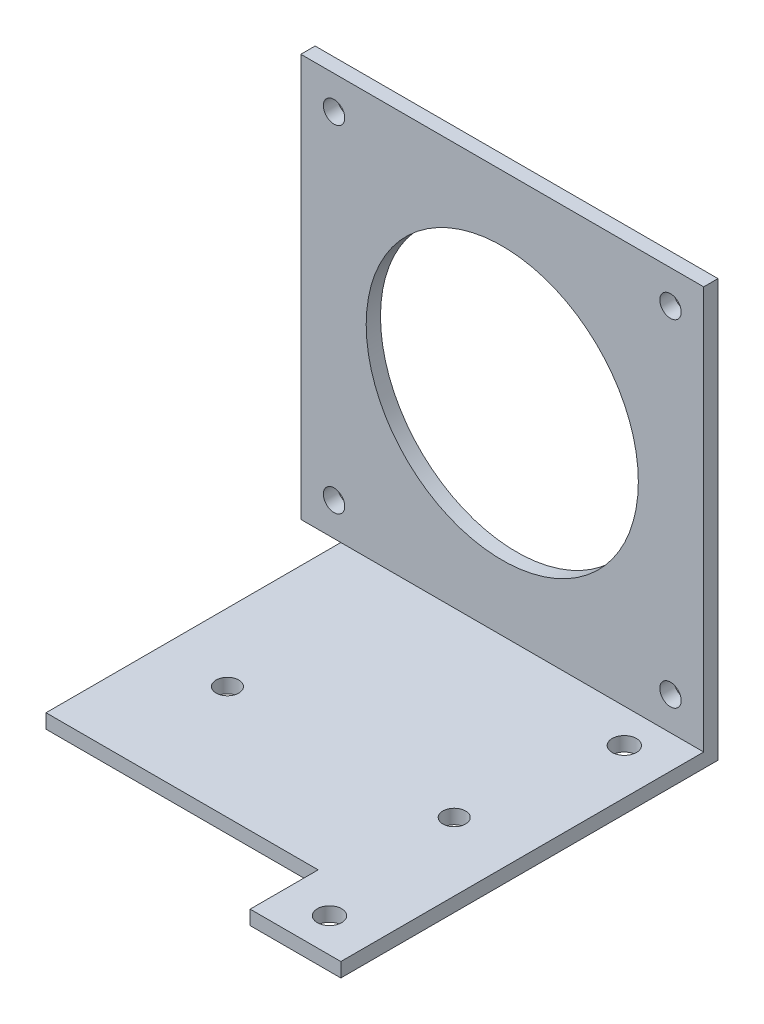
ISO-10303-21;
HEADER;
FILE_DESCRIPTION(('STEP AP214'),'2;1');
FILE_NAME('part.step','',(''),(''),'','','');
FILE_SCHEMA(('AUTOMOTIVE_DESIGN { 1 0 10303 214 1 1 1 1 }'));
ENDSEC;
DATA;
#1=APPLICATION_CONTEXT('core data for automotive mechanical design processes');
#2=APPLICATION_PROTOCOL_DEFINITION('international standard','automotive_design',2000,#1);
#3=PRODUCT_CONTEXT('',#1,'mechanical');
#4=PRODUCT('Part','Part','',(#3));
#5=PRODUCT_RELATED_PRODUCT_CATEGORY('part','',(#4));
#6=PRODUCT_DEFINITION_FORMATION('','',#4);
#7=PRODUCT_DEFINITION_CONTEXT('part definition',#1,'design');
#8=PRODUCT_DEFINITION('design','',#6,#7);
#9=PRODUCT_DEFINITION_SHAPE('','',#8);
#10=(LENGTH_UNIT() NAMED_UNIT(*) SI_UNIT(.MILLI.,.METRE.));
#11=(NAMED_UNIT(*) PLANE_ANGLE_UNIT() SI_UNIT($,.RADIAN.));
#12=(NAMED_UNIT(*) SI_UNIT($,.STERADIAN.) SOLID_ANGLE_UNIT());
#13=UNCERTAINTY_MEASURE_WITH_UNIT(LENGTH_MEASURE(1.E-05),#10,'distance_accuracy_value','');
#14=(GEOMETRIC_REPRESENTATION_CONTEXT(3) GLOBAL_UNCERTAINTY_ASSIGNED_CONTEXT((#13)) GLOBAL_UNIT_ASSIGNED_CONTEXT((#10,
#11,#12)) REPRESENTATION_CONTEXT('',''));
#15=CARTESIAN_POINT('',(0.,0.,0.));
#16=DIRECTION('',(0.,0.,1.));
#17=DIRECTION('',(1.,0.,0.));
#18=AXIS2_PLACEMENT_3D('',#15,#16,#17);
#19=CARTESIAN_POINT('',(0.,2.,0.));
#20=DIRECTION('',(0.,-1.,0.));
#21=DIRECTION('',(0.,0.,-1.));
#22=AXIS2_PLACEMENT_3D('',#19,#20,#21);
#23=PLANE('',#22);
#24=CARTESIAN_POINT('',(41.275,2.,-15.875));
#25=DIRECTION('',(0.,1.,0.));
#26=DIRECTION('',(0.,0.,1.));
#27=AXIS2_PLACEMENT_3D('',#24,#25,#26);
#28=CIRCLE('',#27,1.5875);
#29=CARTESIAN_POINT('',(41.275,2.,-14.2875));
#30=VERTEX_POINT('',#29);
#31=EDGE_CURVE('E234',#30,#30,#28,.T.);
#32=ORIENTED_EDGE('',*,*,#31,.F.);
#33=EDGE_LOOP('',(#32));
#34=FACE_BOUND('',#33,.T.);
#35=CARTESIAN_POINT('',(9.525,2.,-15.875));
#36=DIRECTION('',(0.,1.,0.));
#37=DIRECTION('',(0.,0.,1.));
#38=AXIS2_PLACEMENT_3D('',#35,#36,#37);
#39=CIRCLE('',#38,1.5875);
#40=CARTESIAN_POINT('',(9.525,2.,-14.2875));
#41=VERTEX_POINT('',#40);
#42=EDGE_CURVE('E242',#41,#41,#39,.T.);
#43=ORIENTED_EDGE('',*,*,#42,.F.);
#44=EDGE_LOOP('',(#43));
#45=FACE_BOUND('',#44,.T.);
#46=CARTESIAN_POINT('',(44.45,2.,4.7625));
#47=DIRECTION('',(0.,1.,0.));
#48=DIRECTION('',(0.,0.,1.));
#49=AXIS2_PLACEMENT_3D('',#46,#47,#48);
#50=CIRCLE('',#49,1.7);
#51=CARTESIAN_POINT('',(44.45,2.,6.4625));
#52=VERTEX_POINT('',#51);
#53=EDGE_CURVE('E250',#52,#52,#50,.T.);
#54=ORIENTED_EDGE('',*,*,#53,.F.);
#55=EDGE_LOOP('',(#54));
#56=FACE_BOUND('',#55,.T.);
#57=CARTESIAN_POINT('',(44.45,2.,-36.5125));
#58=DIRECTION('',(0.,1.,0.));
#59=DIRECTION('',(0.,0.,1.));
#60=AXIS2_PLACEMENT_3D('',#57,#58,#59);
#61=CIRCLE('',#60,1.7);
#62=CARTESIAN_POINT('',(44.45,2.,-34.8125));
#63=VERTEX_POINT('',#62);
#64=EDGE_CURVE('E140',#63,#63,#61,.T.);
#65=ORIENTED_EDGE('',*,*,#64,.F.);
#66=EDGE_LOOP('',(#65));
#67=FACE_BOUND('',#66,.T.);
#68=DIRECTION('',(1.,0.,0.));
#69=VECTOR('',#68,1.);
#70=CARTESIAN_POINT('',(50.8,2.,-41.275));
#71=LINE('',#70,#69);
#72=CARTESIAN_POINT('',(0.,2.,-41.275));
#73=VERTEX_POINT('',#72);
#74=CARTESIAN_POINT('',(50.8,2.,-41.275));
#75=VERTEX_POINT('',#74);
#76=EDGE_CURVE('E11',#73,#75,#71,.T.);
#77=ORIENTED_EDGE('',*,*,#76,.F.);
#78=DIRECTION('',(0.,0.,1.));
#79=VECTOR('',#78,1.);
#80=CARTESIAN_POINT('',(0.,2.,0.));
#81=LINE('',#80,#79);
#82=CARTESIAN_POINT('',(0.,2.,0.));
#83=VERTEX_POINT('',#82);
#84=EDGE_CURVE('E95',#73,#83,#81,.T.);
#85=ORIENTED_EDGE('',*,*,#84,.T.);
#86=DIRECTION('',(1.,0.,0.));
#87=VECTOR('',#86,1.);
#88=CARTESIAN_POINT('',(38.1,2.,0.));
#89=LINE('',#88,#87);
#90=CARTESIAN_POINT('',(38.1,2.,0.));
#91=VERTEX_POINT('',#90);
#92=EDGE_CURVE('E108',#83,#91,#89,.T.);
#93=ORIENTED_EDGE('',*,*,#92,.T.);
#94=DIRECTION('',(0.,0.,1.));
#95=VECTOR('',#94,1.);
#96=CARTESIAN_POINT('',(38.1,2.,9.525));
#97=LINE('',#96,#95);
#98=CARTESIAN_POINT('',(38.1,2.,9.525));
#99=VERTEX_POINT('',#98);
#100=EDGE_CURVE('E103',#91,#99,#97,.T.);
#101=ORIENTED_EDGE('',*,*,#100,.T.);
#102=DIRECTION('',(1.,0.,0.));
#103=VECTOR('',#102,1.);
#104=CARTESIAN_POINT('',(50.8,2.,9.525));
#105=LINE('',#104,#103);
#106=CARTESIAN_POINT('',(50.8,2.,9.525));
#107=VERTEX_POINT('',#106);
#108=EDGE_CURVE('E106',#99,#107,#105,.T.);
#109=ORIENTED_EDGE('',*,*,#108,.T.);
#110=DIRECTION('',(0.,0.,-1.));
#111=VECTOR('',#110,1.);
#112=CARTESIAN_POINT('',(50.8,2.,-43.275));
#113=LINE('',#112,#111);
#114=EDGE_CURVE('E129',#107,#75,#113,.T.);
#115=ORIENTED_EDGE('',*,*,#114,.T.);
#116=EDGE_LOOP('',(#77,#85,#93,#101,#109,#115));
#117=FACE_BOUND('',#116,.T.);
#118=ADVANCED_FACE('F39',(#34,#45,#56,#67,#117),#23,.F.);
#119=CARTESIAN_POINT('',(0.,0.,0.));
#120=DIRECTION('',(0.,-1.,0.));
#121=DIRECTION('',(0.,0.,-1.));
#122=AXIS2_PLACEMENT_3D('',#119,#120,#121);
#123=PLANE('',#122);
#124=CARTESIAN_POINT('',(9.525,0.,-15.875));
#125=DIRECTION('',(0.,1.,0.));
#126=DIRECTION('',(0.,0.,1.));
#127=AXIS2_PLACEMENT_3D('',#124,#125,#126);
#128=CIRCLE('',#127,1.5875);
#129=CARTESIAN_POINT('',(9.525,0.,-14.2875));
#130=VERTEX_POINT('',#129);
#131=EDGE_CURVE('E238',#130,#130,#128,.T.);
#132=ORIENTED_EDGE('',*,*,#131,.T.);
#133=EDGE_LOOP('',(#132));
#134=FACE_BOUND('',#133,.T.);
#135=CARTESIAN_POINT('',(44.45,0.,-36.5125));
#136=DIRECTION('',(0.,1.,0.));
#137=DIRECTION('',(0.,0.,1.));
#138=AXIS2_PLACEMENT_3D('',#135,#136,#137);
#139=CIRCLE('',#138,1.7);
#140=CARTESIAN_POINT('',(44.45,0.,-34.8125));
#141=VERTEX_POINT('',#140);
#142=EDGE_CURVE('E254',#141,#141,#139,.T.);
#143=ORIENTED_EDGE('',*,*,#142,.T.);
#144=EDGE_LOOP('',(#143));
#145=FACE_BOUND('',#144,.T.);
#146=DIRECTION('',(0.,0.,1.));
#147=VECTOR('',#146,1.);
#148=CARTESIAN_POINT('',(0.,0.,0.));
#149=LINE('',#148,#147);
#150=CARTESIAN_POINT('',(0.,0.,-43.275));
#151=VERTEX_POINT('',#150);
#152=CARTESIAN_POINT('',(0.,0.,0.));
#153=VERTEX_POINT('',#152);
#154=EDGE_CURVE('E135',#151,#153,#149,.T.);
#155=ORIENTED_EDGE('',*,*,#154,.F.);
#156=DIRECTION('',(-1.,0.,0.));
#157=VECTOR('',#156,1.);
#158=CARTESIAN_POINT('',(0.,0.,-43.275));
#159=LINE('',#158,#157);
#160=CARTESIAN_POINT('',(50.8,0.,-43.275));
#161=VERTEX_POINT('',#160);
#162=EDGE_CURVE('E91',#161,#151,#159,.T.);
#163=ORIENTED_EDGE('',*,*,#162,.F.);
#164=DIRECTION('',(0.,0.,-1.));
#165=VECTOR('',#164,1.);
#166=CARTESIAN_POINT('',(50.8,0.,-43.275));
#167=LINE('',#166,#165);
#168=CARTESIAN_POINT('',(50.8,0.,9.525));
#169=VERTEX_POINT('',#168);
#170=EDGE_CURVE('E148',#169,#161,#167,.T.);
#171=ORIENTED_EDGE('',*,*,#170,.F.);
#172=DIRECTION('',(1.,0.,0.));
#173=VECTOR('',#172,1.);
#174=CARTESIAN_POINT('',(50.8,0.,9.525));
#175=LINE('',#174,#173);
#176=CARTESIAN_POINT('',(38.1,0.,9.525));
#177=VERTEX_POINT('',#176);
#178=EDGE_CURVE('E145',#177,#169,#175,.T.);
#179=ORIENTED_EDGE('',*,*,#178,.F.);
#180=DIRECTION('',(0.,0.,1.));
#181=VECTOR('',#180,1.);
#182=CARTESIAN_POINT('',(38.1,0.,9.525));
#183=LINE('',#182,#181);
#184=CARTESIAN_POINT('',(38.1,0.,0.));
#185=VERTEX_POINT('',#184);
#186=EDGE_CURVE('E118',#185,#177,#183,.T.);
#187=ORIENTED_EDGE('',*,*,#186,.F.);
#188=DIRECTION('',(1.,0.,0.));
#189=VECTOR('',#188,1.);
#190=CARTESIAN_POINT('',(38.1,0.,0.));
#191=LINE('',#190,#189);
#192=EDGE_CURVE('E139',#153,#185,#191,.T.);
#193=ORIENTED_EDGE('',*,*,#192,.F.);
#194=EDGE_LOOP('',(#155,#163,#171,#179,#187,#193));
#195=FACE_BOUND('',#194,.T.);
#196=CARTESIAN_POINT('',(44.45,0.,4.7625));
#197=DIRECTION('',(0.,1.,0.));
#198=DIRECTION('',(0.,0.,1.));
#199=AXIS2_PLACEMENT_3D('',#196,#197,#198);
#200=CIRCLE('',#199,1.7);
#201=CARTESIAN_POINT('',(44.45,0.,6.4625));
#202=VERTEX_POINT('',#201);
#203=EDGE_CURVE('E246',#202,#202,#200,.T.);
#204=ORIENTED_EDGE('',*,*,#203,.T.);
#205=EDGE_LOOP('',(#204));
#206=FACE_BOUND('',#205,.T.);
#207=CARTESIAN_POINT('',(41.275,0.,-15.875));
#208=DIRECTION('',(0.,1.,0.));
#209=DIRECTION('',(0.,0.,1.));
#210=AXIS2_PLACEMENT_3D('',#207,#208,#209);
#211=CIRCLE('',#210,1.5875);
#212=CARTESIAN_POINT('',(41.275,0.,-14.2875));
#213=VERTEX_POINT('',#212);
#214=EDGE_CURVE('E233',#213,#213,#211,.T.);
#215=ORIENTED_EDGE('',*,*,#214,.T.);
#216=EDGE_LOOP('',(#215));
#217=FACE_BOUND('',#216,.T.);
#218=ADVANCED_FACE('F305',(#134,#145,#195,#206,#217),#123,.T.);
#219=CARTESIAN_POINT('',(0.,2.,0.));
#220=DIRECTION('',(1.,0.,0.));
#221=DIRECTION('',(0.,0.,-1.));
#222=AXIS2_PLACEMENT_3D('',#219,#220,#221);
#223=PLANE('',#222);
#224=ORIENTED_EDGE('',*,*,#154,.T.);
#225=DIRECTION('',(0.,-1.,0.));
#226=VECTOR('',#225,1.);
#227=CARTESIAN_POINT('',(0.,2.,0.));
#228=LINE('',#227,#226);
#229=EDGE_CURVE('E49',#83,#153,#228,.T.);
#230=ORIENTED_EDGE('',*,*,#229,.F.);
#231=ORIENTED_EDGE('',*,*,#84,.F.);
#232=CARTESIAN_POINT('',(0.,2.,-43.275));
#233=VERTEX_POINT('',#232);
#234=EDGE_CURVE('E264',#233,#73,#81,.T.);
#235=ORIENTED_EDGE('',*,*,#234,.F.);
#236=DIRECTION('',(0.,-1.,0.));
#237=VECTOR('',#236,1.);
#238=CARTESIAN_POINT('',(0.,2.,-43.275));
#239=LINE('',#238,#237);
#240=EDGE_CURVE('E65',#233,#151,#239,.T.);
#241=ORIENTED_EDGE('',*,*,#240,.T.);
#242=EDGE_LOOP('',(#224,#230,#231,#235,#241));
#243=FACE_BOUND('',#242,.T.);
#244=ADVANCED_FACE('F41',(#243),#223,.F.);
#245=CARTESIAN_POINT('',(38.1,2.,0.));
#246=DIRECTION('',(0.,0.,-1.));
#247=DIRECTION('',(-1.,0.,0.));
#248=AXIS2_PLACEMENT_3D('',#245,#246,#247);
#249=PLANE('',#248);
#250=ORIENTED_EDGE('',*,*,#192,.T.);
#251=DIRECTION('',(0.,-1.,0.));
#252=VECTOR('',#251,1.);
#253=CARTESIAN_POINT('',(38.1,2.,0.));
#254=LINE('',#253,#252);
#255=EDGE_CURVE('E122',#91,#185,#254,.T.);
#256=ORIENTED_EDGE('',*,*,#255,.F.);
#257=ORIENTED_EDGE('',*,*,#92,.F.);
#258=ORIENTED_EDGE('',*,*,#229,.T.);
#259=EDGE_LOOP('',(#250,#256,#257,#258));
#260=FACE_BOUND('',#259,.T.);
#261=ADVANCED_FACE('F309',(#260),#249,.F.);
#262=CARTESIAN_POINT('',(38.1,2.,9.525));
#263=DIRECTION('',(1.,0.,0.));
#264=DIRECTION('',(0.,0.,-1.));
#265=AXIS2_PLACEMENT_3D('',#262,#263,#264);
#266=PLANE('',#265);
#267=ORIENTED_EDGE('',*,*,#186,.T.);
#268=DIRECTION('',(0.,-1.,0.));
#269=VECTOR('',#268,1.);
#270=CARTESIAN_POINT('',(38.1,2.,9.525));
#271=LINE('',#270,#269);
#272=EDGE_CURVE('E115',#99,#177,#271,.T.);
#273=ORIENTED_EDGE('',*,*,#272,.F.);
#274=ORIENTED_EDGE('',*,*,#100,.F.);
#275=ORIENTED_EDGE('',*,*,#255,.T.);
#276=EDGE_LOOP('',(#267,#273,#274,#275));
#277=FACE_BOUND('',#276,.T.);
#278=ADVANCED_FACE('F116',(#277),#266,.F.);
#279=CARTESIAN_POINT('',(50.8,2.,9.525));
#280=DIRECTION('',(0.,0.,-1.));
#281=DIRECTION('',(-1.,0.,0.));
#282=AXIS2_PLACEMENT_3D('',#279,#280,#281);
#283=PLANE('',#282);
#284=ORIENTED_EDGE('',*,*,#178,.T.);
#285=DIRECTION('',(0.,-1.,0.));
#286=VECTOR('',#285,1.);
#287=CARTESIAN_POINT('',(50.8,2.,9.525));
#288=LINE('',#287,#286);
#289=EDGE_CURVE('E123',#107,#169,#288,.T.);
#290=ORIENTED_EDGE('',*,*,#289,.F.);
#291=ORIENTED_EDGE('',*,*,#108,.F.);
#292=ORIENTED_EDGE('',*,*,#272,.T.);
#293=EDGE_LOOP('',(#284,#290,#291,#292));
#294=FACE_BOUND('',#293,.T.);
#295=ADVANCED_FACE('F125',(#294),#283,.F.);
#296=CARTESIAN_POINT('',(50.8,2.,-43.275));
#297=DIRECTION('',(-1.,0.,0.));
#298=DIRECTION('',(0.,0.,1.));
#299=AXIS2_PLACEMENT_3D('',#296,#297,#298);
#300=PLANE('',#299);
#301=ORIENTED_EDGE('',*,*,#170,.T.);
#302=DIRECTION('',(0.,-1.,0.));
#303=VECTOR('',#302,1.);
#304=CARTESIAN_POINT('',(50.8,2.,-43.275));
#305=LINE('',#304,#303);
#306=CARTESIAN_POINT('',(50.8,58.4,-43.275));
#307=VERTEX_POINT('',#306);
#308=EDGE_CURVE('E155',#307,#161,#305,.T.);
#309=ORIENTED_EDGE('',*,*,#308,.F.);
#310=DIRECTION('',(0.,0.,-1.));
#311=VECTOR('',#310,1.);
#312=CARTESIAN_POINT('',(50.8,58.4,-43.275));
#313=LINE('',#312,#311);
#314=CARTESIAN_POINT('',(50.8,58.4,-41.275));
#315=VERTEX_POINT('',#314);
#316=EDGE_CURVE('E209',#315,#307,#313,.T.);
#317=ORIENTED_EDGE('',*,*,#316,.F.);
#318=DIRECTION('',(0.,-1.,0.));
#319=VECTOR('',#318,1.);
#320=CARTESIAN_POINT('',(50.8,58.4,-41.275));
#321=LINE('',#320,#319);
#322=EDGE_CURVE('E213',#315,#75,#321,.T.);
#323=ORIENTED_EDGE('',*,*,#322,.T.);
#324=ORIENTED_EDGE('',*,*,#114,.F.);
#325=ORIENTED_EDGE('',*,*,#289,.T.);
#326=EDGE_LOOP('',(#301,#309,#317,#323,#324,#325));
#327=FACE_BOUND('',#326,.T.);
#328=ADVANCED_FACE('F301',(#327),#300,.F.);
#329=CARTESIAN_POINT('',(0.,2.,-43.275));
#330=DIRECTION('',(0.,0.,1.));
#331=DIRECTION('',(1.,0.,0.));
#332=AXIS2_PLACEMENT_3D('',#329,#330,#331);
#333=PLANE('',#332);
#334=CARTESIAN_POINT('',(-0.949999999999996,53.75,-43.275));
#335=DIRECTION('',(0.,0.,-1.));
#336=DIRECTION('',(-1.,0.,0.));
#337=AXIS2_PLACEMENT_3D('',#334,#335,#336);
#338=CIRCLE('',#337,1.5);
#339=CARTESIAN_POINT('',(-2.45,53.75,-43.275));
#340=VERTEX_POINT('',#339);
#341=EDGE_CURVE('E176',#340,#340,#338,.T.);
#342=ORIENTED_EDGE('',*,*,#341,.F.);
#343=EDGE_LOOP('',(#342));
#344=FACE_BOUND('',#343,.T.);
#345=CARTESIAN_POINT('',(-0.949999999999996,6.65,-43.275));
#346=DIRECTION('',(0.,0.,-1.));
#347=DIRECTION('',(-1.,0.,0.));
#348=AXIS2_PLACEMENT_3D('',#345,#346,#347);
#349=CIRCLE('',#348,1.5);
#350=CARTESIAN_POINT('',(-2.45,6.65,-43.275));
#351=VERTEX_POINT('',#350);
#352=EDGE_CURVE('E508',#351,#351,#349,.T.);
#353=ORIENTED_EDGE('',*,*,#352,.F.);
#354=EDGE_LOOP('',(#353));
#355=FACE_BOUND('',#354,.T.);
#356=CARTESIAN_POINT('',(46.15,6.65,-43.275));
#357=DIRECTION('',(0.,0.,-1.));
#358=DIRECTION('',(-1.,0.,0.));
#359=AXIS2_PLACEMENT_3D('',#356,#357,#358);
#360=CIRCLE('',#359,1.5);
#361=CARTESIAN_POINT('',(44.65,6.65,-43.275));
#362=VERTEX_POINT('',#361);
#363=EDGE_CURVE('E512',#362,#362,#360,.T.);
#364=ORIENTED_EDGE('',*,*,#363,.F.);
#365=EDGE_LOOP('',(#364));
#366=FACE_BOUND('',#365,.T.);
#367=CARTESIAN_POINT('',(46.15,53.75,-43.275));
#368=DIRECTION('',(0.,0.,-1.));
#369=DIRECTION('',(-1.,0.,0.));
#370=AXIS2_PLACEMENT_3D('',#367,#368,#369);
#371=CIRCLE('',#370,1.5);
#372=CARTESIAN_POINT('',(44.65,53.75,-43.275));
#373=VERTEX_POINT('',#372);
#374=EDGE_CURVE('E195',#373,#373,#371,.T.);
#375=ORIENTED_EDGE('',*,*,#374,.F.);
#376=EDGE_LOOP('',(#375));
#377=FACE_BOUND('',#376,.T.);
#378=CARTESIAN_POINT('',(22.6,30.2,-43.275));
#379=DIRECTION('',(0.,0.,-1.));
#380=DIRECTION('',(-1.,0.,0.));
#381=AXIS2_PLACEMENT_3D('',#378,#379,#380);
#382=CIRCLE('',#381,19.05);
#383=CARTESIAN_POINT('',(3.55,30.2,-43.275));
#384=VERTEX_POINT('',#383);
#385=EDGE_CURVE('E170',#384,#384,#382,.T.);
#386=ORIENTED_EDGE('',*,*,#385,.F.);
#387=EDGE_LOOP('',(#386));
#388=FACE_BOUND('',#387,.T.);
#389=ORIENTED_EDGE('',*,*,#162,.T.);
#390=ORIENTED_EDGE('',*,*,#240,.F.);
#391=DIRECTION('',(-1.,0.,0.));
#392=VECTOR('',#391,1.);
#393=CARTESIAN_POINT('',(-5.59999999999999,2.,-43.275));
#394=LINE('',#393,#392);
#395=CARTESIAN_POINT('',(-5.59999999999999,2.,-43.275));
#396=VERTEX_POINT('',#395);
#397=EDGE_CURVE('E169',#233,#396,#394,.T.);
#398=ORIENTED_EDGE('',*,*,#397,.T.);
#399=DIRECTION('',(0.,-1.,0.));
#400=VECTOR('',#399,1.);
#401=CARTESIAN_POINT('',(-5.59999999999999,58.4,-43.275));
#402=LINE('',#401,#400);
#403=CARTESIAN_POINT('',(-5.59999999999999,58.4,-43.275));
#404=VERTEX_POINT('',#403);
#405=EDGE_CURVE('E229',#404,#396,#402,.T.);
#406=ORIENTED_EDGE('',*,*,#405,.F.);
#407=DIRECTION('',(-1.,0.,0.));
#408=VECTOR('',#407,1.);
#409=CARTESIAN_POINT('',(-5.59999999999999,58.4,-43.275));
#410=LINE('',#409,#408);
#411=EDGE_CURVE('E197',#307,#404,#410,.T.);
#412=ORIENTED_EDGE('',*,*,#411,.F.);
#413=ORIENTED_EDGE('',*,*,#308,.T.);
#414=EDGE_LOOP('',(#389,#390,#398,#406,#412,#413));
#415=FACE_BOUND('',#414,.T.);
#416=ADVANCED_FACE('F296',(#344,#355,#366,#377,#388,#415),#333,.F.);
#417=CARTESIAN_POINT('',(44.45,2.,-36.5125));
#418=DIRECTION('',(0.,-1.,0.));
#419=DIRECTION('',(0.,0.,-1.));
#420=AXIS2_PLACEMENT_3D('',#417,#418,#419);
#421=CYLINDRICAL_SURFACE('',#420,1.7);
#422=ORIENTED_EDGE('',*,*,#64,.T.);
#423=EDGE_LOOP('',(#422));
#424=FACE_BOUND('',#423,.T.);
#425=ORIENTED_EDGE('',*,*,#142,.F.);
#426=EDGE_LOOP('',(#425));
#427=FACE_BOUND('',#426,.T.);
#428=ADVANCED_FACE('F327',(#424,#427),#421,.F.);
#429=CARTESIAN_POINT('',(44.45,2.,4.7625));
#430=DIRECTION('',(0.,-1.,0.));
#431=DIRECTION('',(0.,0.,-1.));
#432=AXIS2_PLACEMENT_3D('',#429,#430,#431);
#433=CYLINDRICAL_SURFACE('',#432,1.7);
#434=ORIENTED_EDGE('',*,*,#53,.T.);
#435=EDGE_LOOP('',(#434));
#436=FACE_BOUND('',#435,.T.);
#437=ORIENTED_EDGE('',*,*,#203,.F.);
#438=EDGE_LOOP('',(#437));
#439=FACE_BOUND('',#438,.T.);
#440=ADVANCED_FACE('F358',(#436,#439),#433,.F.);
#441=CARTESIAN_POINT('',(9.525,2.,-15.875));
#442=DIRECTION('',(0.,-1.,0.));
#443=DIRECTION('',(0.,0.,-1.));
#444=AXIS2_PLACEMENT_3D('',#441,#442,#443);
#445=CYLINDRICAL_SURFACE('',#444,1.5875);
#446=ORIENTED_EDGE('',*,*,#42,.T.);
#447=EDGE_LOOP('',(#446));
#448=FACE_BOUND('',#447,.T.);
#449=ORIENTED_EDGE('',*,*,#131,.F.);
#450=EDGE_LOOP('',(#449));
#451=FACE_BOUND('',#450,.T.);
#452=ADVANCED_FACE('F365',(#448,#451),#445,.F.);
#453=CARTESIAN_POINT('',(41.275,2.,-15.875));
#454=DIRECTION('',(0.,-1.,0.));
#455=DIRECTION('',(0.,0.,-1.));
#456=AXIS2_PLACEMENT_3D('',#453,#454,#455);
#457=CYLINDRICAL_SURFACE('',#456,1.5875);
#458=ORIENTED_EDGE('',*,*,#31,.T.);
#459=EDGE_LOOP('',(#458));
#460=FACE_BOUND('',#459,.T.);
#461=ORIENTED_EDGE('',*,*,#214,.F.);
#462=EDGE_LOOP('',(#461));
#463=FACE_BOUND('',#462,.T.);
#464=ADVANCED_FACE('F372',(#460,#463),#457,.F.);
#465=CARTESIAN_POINT('',(-5.59999999999999,58.4,-41.275));
#466=DIRECTION('',(1.,0.,0.));
#467=DIRECTION('',(0.,0.,-1.));
#468=AXIS2_PLACEMENT_3D('',#465,#466,#467);
#469=PLANE('',#468);
#470=DIRECTION('',(0.,0.,1.));
#471=VECTOR('',#470,1.);
#472=CARTESIAN_POINT('',(-5.59999999999999,2.,-41.275));
#473=LINE('',#472,#471);
#474=CARTESIAN_POINT('',(-5.59999999999999,2.,-41.275));
#475=VERTEX_POINT('',#474);
#476=EDGE_CURVE('E216',#396,#475,#473,.T.);
#477=ORIENTED_EDGE('',*,*,#476,.T.);
#478=DIRECTION('',(0.,-1.,0.));
#479=VECTOR('',#478,1.);
#480=CARTESIAN_POINT('',(-5.59999999999999,58.4,-41.275));
#481=LINE('',#480,#479);
#482=CARTESIAN_POINT('',(-5.59999999999999,58.4,-41.275));
#483=VERTEX_POINT('',#482);
#484=EDGE_CURVE('E225',#483,#475,#481,.T.);
#485=ORIENTED_EDGE('',*,*,#484,.F.);
#486=DIRECTION('',(0.,0.,1.));
#487=VECTOR('',#486,1.);
#488=CARTESIAN_POINT('',(-5.59999999999999,58.4,-41.275));
#489=LINE('',#488,#487);
#490=EDGE_CURVE('E201',#404,#483,#489,.T.);
#491=ORIENTED_EDGE('',*,*,#490,.F.);
#492=ORIENTED_EDGE('',*,*,#405,.T.);
#493=EDGE_LOOP('',(#477,#485,#491,#492));
#494=FACE_BOUND('',#493,.T.);
#495=ADVANCED_FACE('F285',(#494),#469,.F.);
#496=CARTESIAN_POINT('',(50.8,58.4,-41.275));
#497=DIRECTION('',(0.,0.,-1.));
#498=DIRECTION('',(-1.,0.,0.));
#499=AXIS2_PLACEMENT_3D('',#496,#497,#498);
#500=PLANE('',#499);
#501=CARTESIAN_POINT('',(-0.949999999999996,53.75,-41.275));
#502=DIRECTION('',(0.,0.,-1.));
#503=DIRECTION('',(-1.,0.,0.));
#504=AXIS2_PLACEMENT_3D('',#501,#502,#503);
#505=CIRCLE('',#504,1.5);
#506=CARTESIAN_POINT('',(-2.45,53.75,-41.275));
#507=VERTEX_POINT('',#506);
#508=EDGE_CURVE('E43',#507,#507,#505,.T.);
#509=ORIENTED_EDGE('',*,*,#508,.T.);
#510=EDGE_LOOP('',(#509));
#511=FACE_BOUND('',#510,.T.);
#512=CARTESIAN_POINT('',(-0.949999999999996,6.65,-41.275));
#513=DIRECTION('',(0.,0.,-1.));
#514=DIRECTION('',(-1.,0.,0.));
#515=AXIS2_PLACEMENT_3D('',#512,#513,#514);
#516=CIRCLE('',#515,1.5);
#517=CARTESIAN_POINT('',(-2.45,6.65,-41.275));
#518=VERTEX_POINT('',#517);
#519=EDGE_CURVE('E179',#518,#518,#516,.T.);
#520=ORIENTED_EDGE('',*,*,#519,.T.);
#521=EDGE_LOOP('',(#520));
#522=FACE_BOUND('',#521,.T.);
#523=CARTESIAN_POINT('',(46.15,6.65,-41.275));
#524=DIRECTION('',(0.,0.,-1.));
#525=DIRECTION('',(-1.,0.,0.));
#526=AXIS2_PLACEMENT_3D('',#523,#524,#525);
#527=CIRCLE('',#526,1.5);
#528=CARTESIAN_POINT('',(44.65,6.65,-41.275));
#529=VERTEX_POINT('',#528);
#530=EDGE_CURVE('E175',#529,#529,#527,.T.);
#531=ORIENTED_EDGE('',*,*,#530,.T.);
#532=EDGE_LOOP('',(#531));
#533=FACE_BOUND('',#532,.T.);
#534=CARTESIAN_POINT('',(46.15,53.75,-41.275));
#535=DIRECTION('',(0.,0.,-1.));
#536=DIRECTION('',(-1.,0.,0.));
#537=AXIS2_PLACEMENT_3D('',#534,#535,#536);
#538=CIRCLE('',#537,1.5);
#539=CARTESIAN_POINT('',(44.65,53.75,-41.275));
#540=VERTEX_POINT('',#539);
#541=EDGE_CURVE('E171',#540,#540,#538,.T.);
#542=ORIENTED_EDGE('',*,*,#541,.T.);
#543=EDGE_LOOP('',(#542));
#544=FACE_BOUND('',#543,.T.);
#545=CARTESIAN_POINT('',(22.6,30.2,-41.275));
#546=DIRECTION('',(0.,0.,-1.));
#547=DIRECTION('',(-1.,0.,0.));
#548=AXIS2_PLACEMENT_3D('',#545,#546,#547);
#549=CIRCLE('',#548,19.05);
#550=CARTESIAN_POINT('',(3.55,30.2,-41.275));
#551=VERTEX_POINT('',#550);
#552=EDGE_CURVE('E165',#551,#551,#549,.T.);
#553=ORIENTED_EDGE('',*,*,#552,.T.);
#554=EDGE_LOOP('',(#553));
#555=FACE_BOUND('',#554,.T.);
#556=EDGE_CURVE('E51',#475,#73,#71,.T.);
#557=ORIENTED_EDGE('',*,*,#556,.T.);
#558=ORIENTED_EDGE('',*,*,#76,.T.);
#559=ORIENTED_EDGE('',*,*,#322,.F.);
#560=DIRECTION('',(1.,0.,0.));
#561=VECTOR('',#560,1.);
#562=CARTESIAN_POINT('',(50.8,58.4,-41.275));
#563=LINE('',#562,#561);
#564=EDGE_CURVE('E205',#483,#315,#563,.T.);
#565=ORIENTED_EDGE('',*,*,#564,.F.);
#566=ORIENTED_EDGE('',*,*,#484,.T.);
#567=EDGE_LOOP('',(#557,#558,#559,#565,#566));
#568=FACE_BOUND('',#567,.T.);
#569=ADVANCED_FACE('F277',(#511,#522,#533,#544,#555,#568),#500,.F.);
#570=CARTESIAN_POINT('',(0.,58.4,0.));
#571=DIRECTION('',(0.,-1.,0.));
#572=DIRECTION('',(0.,0.,-1.));
#573=AXIS2_PLACEMENT_3D('',#570,#571,#572);
#574=PLANE('',#573);
#575=ORIENTED_EDGE('',*,*,#411,.T.);
#576=ORIENTED_EDGE('',*,*,#490,.T.);
#577=ORIENTED_EDGE('',*,*,#564,.T.);
#578=ORIENTED_EDGE('',*,*,#316,.T.);
#579=EDGE_LOOP('',(#575,#576,#577,#578));
#580=FACE_BOUND('',#579,.T.);
#581=ADVANCED_FACE('F298',(#580),#574,.F.);
#582=CARTESIAN_POINT('',(0.,2.,0.));
#583=DIRECTION('',(0.,-1.,0.));
#584=DIRECTION('',(0.,0.,-1.));
#585=AXIS2_PLACEMENT_3D('',#582,#583,#584);
#586=PLANE('',#585);
#587=ORIENTED_EDGE('',*,*,#397,.F.);
#588=ORIENTED_EDGE('',*,*,#234,.T.);
#589=ORIENTED_EDGE('',*,*,#556,.F.);
#590=ORIENTED_EDGE('',*,*,#476,.F.);
#591=EDGE_LOOP('',(#587,#588,#589,#590));
#592=FACE_BOUND('',#591,.T.);
#593=ADVANCED_FACE('F272',(#592),#586,.T.);
#594=CARTESIAN_POINT('',(22.6,30.2,9.525));
#595=DIRECTION('',(0.,0.,-1.));
#596=DIRECTION('',(-1.,0.,0.));
#597=AXIS2_PLACEMENT_3D('',#594,#595,#596);
#598=CYLINDRICAL_SURFACE('',#597,19.05);
#599=ORIENTED_EDGE('',*,*,#385,.T.);
#600=EDGE_LOOP('',(#599));
#601=FACE_BOUND('',#600,.T.);
#602=ORIENTED_EDGE('',*,*,#552,.F.);
#603=EDGE_LOOP('',(#602));
#604=FACE_BOUND('',#603,.T.);
#605=ADVANCED_FACE('F403',(#601,#604),#598,.F.);
#606=CARTESIAN_POINT('',(46.15,53.75,9.525));
#607=DIRECTION('',(0.,0.,-1.));
#608=DIRECTION('',(-1.,0.,0.));
#609=AXIS2_PLACEMENT_3D('',#606,#607,#608);
#610=CYLINDRICAL_SURFACE('',#609,1.5);
#611=ORIENTED_EDGE('',*,*,#374,.T.);
#612=EDGE_LOOP('',(#611));
#613=FACE_BOUND('',#612,.T.);
#614=ORIENTED_EDGE('',*,*,#541,.F.);
#615=EDGE_LOOP('',(#614));
#616=FACE_BOUND('',#615,.T.);
#617=ADVANCED_FACE('F409',(#613,#616),#610,.F.);
#618=CARTESIAN_POINT('',(46.15,6.65,9.525));
#619=DIRECTION('',(0.,0.,-1.));
#620=DIRECTION('',(-1.,0.,0.));
#621=AXIS2_PLACEMENT_3D('',#618,#619,#620);
#622=CYLINDRICAL_SURFACE('',#621,1.5);
#623=ORIENTED_EDGE('',*,*,#363,.T.);
#624=EDGE_LOOP('',(#623));
#625=FACE_BOUND('',#624,.T.);
#626=ORIENTED_EDGE('',*,*,#530,.F.);
#627=EDGE_LOOP('',(#626));
#628=FACE_BOUND('',#627,.T.);
#629=ADVANCED_FACE('F416',(#625,#628),#622,.F.);
#630=CARTESIAN_POINT('',(-0.949999999999996,6.65,9.525));
#631=DIRECTION('',(0.,0.,-1.));
#632=DIRECTION('',(-1.,0.,0.));
#633=AXIS2_PLACEMENT_3D('',#630,#631,#632);
#634=CYLINDRICAL_SURFACE('',#633,1.5);
#635=ORIENTED_EDGE('',*,*,#352,.T.);
#636=EDGE_LOOP('',(#635));
#637=FACE_BOUND('',#636,.T.);
#638=ORIENTED_EDGE('',*,*,#519,.F.);
#639=EDGE_LOOP('',(#638));
#640=FACE_BOUND('',#639,.T.);
#641=ADVANCED_FACE('F424',(#637,#640),#634,.F.);
#642=CARTESIAN_POINT('',(-0.949999999999996,53.75,9.525));
#643=DIRECTION('',(0.,0.,-1.));
#644=DIRECTION('',(-1.,0.,0.));
#645=AXIS2_PLACEMENT_3D('',#642,#643,#644);
#646=CYLINDRICAL_SURFACE('',#645,1.5);
#647=ORIENTED_EDGE('',*,*,#341,.T.);
#648=EDGE_LOOP('',(#647));
#649=FACE_BOUND('',#648,.T.);
#650=ORIENTED_EDGE('',*,*,#508,.F.);
#651=EDGE_LOOP('',(#650));
#652=FACE_BOUND('',#651,.T.);
#653=ADVANCED_FACE('F432',(#649,#652),#646,.F.);
#654=CLOSED_SHELL('',(#118,#218,#244,#261,#278,#295,#328,#416,#428,#440,#452,#464,#495,#569,
#581,#593,#605,#617,#629,#641,#653));
#655=MANIFOLD_SOLID_BREP('B2',#654);
#656=ADVANCED_BREP_SHAPE_REPRESENTATION('',(#18,#655),#14);
#657=SHAPE_DEFINITION_REPRESENTATION(#9,#656);
ENDSEC;
END-ISO-10303-21;
